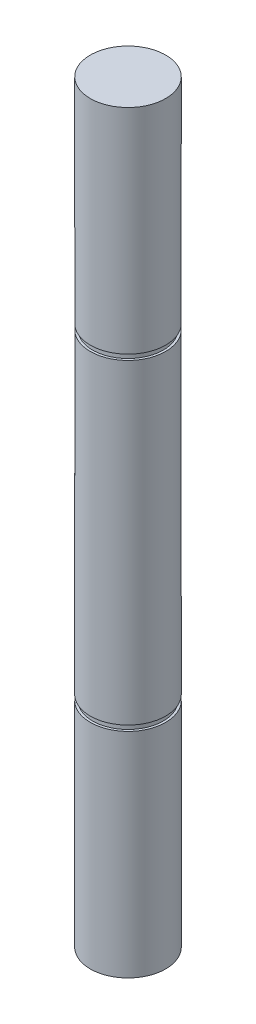
ISO-10303-21;
HEADER;
FILE_DESCRIPTION(('STEP AP214'),'2;1');
FILE_NAME('part.step','',(''),(''),'','','');
FILE_SCHEMA(('AUTOMOTIVE_DESIGN { 1 0 10303 214 1 1 1 1 }'));
ENDSEC;
DATA;
#1=APPLICATION_CONTEXT('core data for automotive mechanical design processes');
#2=APPLICATION_PROTOCOL_DEFINITION('international standard','automotive_design',2000,#1);
#3=PRODUCT_CONTEXT('',#1,'mechanical');
#4=PRODUCT('Part','Part','',(#3));
#5=PRODUCT_RELATED_PRODUCT_CATEGORY('part','',(#4));
#6=PRODUCT_DEFINITION_FORMATION('','',#4);
#7=PRODUCT_DEFINITION_CONTEXT('part definition',#1,'design');
#8=PRODUCT_DEFINITION('design','',#6,#7);
#9=PRODUCT_DEFINITION_SHAPE('','',#8);
#10=(LENGTH_UNIT() NAMED_UNIT(*) SI_UNIT(.MILLI.,.METRE.));
#11=(NAMED_UNIT(*) PLANE_ANGLE_UNIT() SI_UNIT($,.RADIAN.));
#12=(NAMED_UNIT(*) SI_UNIT($,.STERADIAN.) SOLID_ANGLE_UNIT());
#13=UNCERTAINTY_MEASURE_WITH_UNIT(LENGTH_MEASURE(1.E-05),#10,'distance_accuracy_value','');
#14=(GEOMETRIC_REPRESENTATION_CONTEXT(3) GLOBAL_UNCERTAINTY_ASSIGNED_CONTEXT((#13)) GLOBAL_UNIT_ASSIGNED_CONTEXT((#10,
#11,#12)) REPRESENTATION_CONTEXT('',''));
#15=CARTESIAN_POINT('',(0.,0.,0.));
#16=DIRECTION('',(0.,0.,1.));
#17=DIRECTION('',(1.,0.,0.));
#18=AXIS2_PLACEMENT_3D('',#15,#16,#17);
#19=CARTESIAN_POINT('',(0.,-95.25,0.));
#20=DIRECTION('',(0.,1.,0.));
#21=DIRECTION('',(0.,0.,1.));
#22=AXIS2_PLACEMENT_3D('',#19,#20,#21);
#23=CYLINDRICAL_SURFACE('',#22,4.7625);
#24=CARTESIAN_POINT('',(0.,-95.25,0.));
#25=DIRECTION('',(0.,1.,0.));
#26=DIRECTION('',(0.,0.,1.));
#27=AXIS2_PLACEMENT_3D('',#24,#25,#26);
#28=CIRCLE('',#27,4.7625);
#29=CARTESIAN_POINT('',(0.,-95.25,4.7625));
#30=VERTEX_POINT('',#29);
#31=EDGE_CURVE('E62',#30,#30,#28,.T.);
#32=ORIENTED_EDGE('',*,*,#31,.T.);
#33=EDGE_LOOP('',(#32));
#34=FACE_BOUND('',#33,.T.);
#35=CARTESIAN_POINT('',(0.,-68.2625,0.));
#36=DIRECTION('',(0.,1.,0.));
#37=DIRECTION('',(0.,0.,1.));
#38=AXIS2_PLACEMENT_3D('',#35,#36,#37);
#39=CIRCLE('',#38,4.7625);
#40=CARTESIAN_POINT('',(0.,-68.2625,4.7625));
#41=VERTEX_POINT('',#40);
#42=EDGE_CURVE('E68',#41,#41,#39,.F.);
#43=ORIENTED_EDGE('',*,*,#42,.T.);
#44=EDGE_LOOP('',(#43));
#45=FACE_BOUND('',#44,.T.);
#46=ADVANCED_FACE('F39',(#34,#45),#23,.T.);
#47=CARTESIAN_POINT('',(0.,-95.25,0.));
#48=DIRECTION('',(0.,1.,0.));
#49=DIRECTION('',(0.,0.,1.));
#50=AXIS2_PLACEMENT_3D('',#47,#48,#49);
#51=PLANE('',#50);
#52=ORIENTED_EDGE('',*,*,#31,.F.);
#53=EDGE_LOOP('',(#52));
#54=FACE_BOUND('',#53,.T.);
#55=ADVANCED_FACE('F86',(#54),#51,.F.);
#56=CARTESIAN_POINT('',(0.,-68.2625,0.));
#57=DIRECTION('',(0.,1.,0.));
#58=DIRECTION('',(0.,0.,1.));
#59=AXIS2_PLACEMENT_3D('',#56,#57,#58);
#60=PLANE('',#59);
#61=CARTESIAN_POINT('',(0.,-68.2625,0.));
#62=DIRECTION('',(0.,1.,0.));
#63=DIRECTION('',(0.,0.,1.));
#64=AXIS2_PLACEMENT_3D('',#61,#62,#63);
#65=CIRCLE('',#64,4.4704);
#66=CARTESIAN_POINT('',(0.,-68.2625,-4.4704));
#67=VERTEX_POINT('',#66);
#68=EDGE_CURVE('E72',#67,#67,#65,.T.);
#69=ORIENTED_EDGE('',*,*,#68,.F.);
#70=EDGE_LOOP('',(#69));
#71=FACE_BOUND('',#70,.T.);
#72=ORIENTED_EDGE('',*,*,#42,.F.);
#73=EDGE_LOOP('',(#72));
#74=FACE_BOUND('',#73,.T.);
#75=ADVANCED_FACE('F83',(#71,#74),#60,.T.);
#76=CARTESIAN_POINT('',(0.,-54.9324993815346,0.));
#77=DIRECTION('',(0.,-1.,0.));
#78=DIRECTION('',(0.,0.,-1.));
#79=AXIS2_PLACEMENT_3D('',#76,#77,#78);
#80=CYLINDRICAL_SURFACE('',#79,4.4704);
#81=CARTESIAN_POINT('',(0.,-67.5767,0.));
#82=DIRECTION('',(0.,1.,0.));
#83=DIRECTION('',(0.,0.,1.));
#84=AXIS2_PLACEMENT_3D('',#81,#82,#83);
#85=CIRCLE('',#84,4.4704);
#86=CARTESIAN_POINT('',(0.,-67.5767,-4.4704));
#87=VERTEX_POINT('',#86);
#88=EDGE_CURVE('E73',#87,#87,#85,.T.);
#89=CARTESIAN_POINT('',(0.,-68.2625,-4.4704));
#90=CARTESIAN_POINT('',(0.,-68.25535625,-4.4704));
#91=CARTESIAN_POINT('',(0.,-68.2482125,-4.4704));
#92=CARTESIAN_POINT('',(0.,-68.233925,-4.4704));
#93=CARTESIAN_POINT('',(0.,-68.22678125,-4.4704));
#94=CARTESIAN_POINT('',(0.,-68.21249375,-4.4704));
#95=CARTESIAN_POINT('',(0.,-68.20535,-4.4704));
#96=CARTESIAN_POINT('',(0.,-68.1910625,-4.4704));
#97=CARTESIAN_POINT('',(0.,-68.18391875,-4.4704));
#98=CARTESIAN_POINT('',(0.,-68.16963125,-4.4704));
#99=CARTESIAN_POINT('',(0.,-68.1624875,-4.4704));
#100=CARTESIAN_POINT('',(0.,-68.1482,-4.4704));
#101=CARTESIAN_POINT('',(0.,-68.14105625,-4.4704));
#102=CARTESIAN_POINT('',(0.,-68.12676875,-4.4704));
#103=CARTESIAN_POINT('',(0.,-68.119625,-4.4704));
#104=CARTESIAN_POINT('',(0.,-68.1053375,-4.4704));
#105=CARTESIAN_POINT('',(0.,-68.09819375,-4.4704));
#106=CARTESIAN_POINT('',(0.,-68.08390625,-4.4704));
#107=CARTESIAN_POINT('',(0.,-68.0767625,-4.4704));
#108=CARTESIAN_POINT('',(0.,-68.062475,-4.4704));
#109=CARTESIAN_POINT('',(0.,-68.05533125,-4.4704));
#110=CARTESIAN_POINT('',(0.,-68.04104375,-4.4704));
#111=CARTESIAN_POINT('',(0.,-68.0339,-4.4704));
#112=CARTESIAN_POINT('',(0.,-68.0196125,-4.4704));
#113=CARTESIAN_POINT('',(0.,-68.01246875,-4.4704));
#114=CARTESIAN_POINT('',(0.,-67.99818125,-4.4704));
#115=CARTESIAN_POINT('',(0.,-67.9910375,-4.4704));
#116=CARTESIAN_POINT('',(0.,-67.97675,-4.4704));
#117=CARTESIAN_POINT('',(0.,-67.96960625,-4.4704));
#118=CARTESIAN_POINT('',(0.,-67.95531875,-4.4704));
#119=CARTESIAN_POINT('',(0.,-67.948175,-4.4704));
#120=CARTESIAN_POINT('',(0.,-67.9338875,-4.4704));
#121=CARTESIAN_POINT('',(0.,-67.92674375,-4.4704));
#122=CARTESIAN_POINT('',(0.,-67.91245625,-4.4704));
#123=CARTESIAN_POINT('',(0.,-67.9053125,-4.4704));
#124=CARTESIAN_POINT('',(0.,-67.891025,-4.4704));
#125=CARTESIAN_POINT('',(0.,-67.88388125,-4.4704));
#126=CARTESIAN_POINT('',(0.,-67.86959375,-4.4704));
#127=CARTESIAN_POINT('',(0.,-67.86245,-4.4704));
#128=CARTESIAN_POINT('',(0.,-67.8481625,-4.4704));
#129=CARTESIAN_POINT('',(0.,-67.84101875,-4.4704));
#130=CARTESIAN_POINT('',(0.,-67.82673125,-4.4704));
#131=CARTESIAN_POINT('',(0.,-67.8195875,-4.4704));
#132=CARTESIAN_POINT('',(0.,-67.8053,-4.4704));
#133=CARTESIAN_POINT('',(0.,-67.79815625,-4.4704));
#134=CARTESIAN_POINT('',(0.,-67.78386875,-4.4704));
#135=CARTESIAN_POINT('',(0.,-67.776725,-4.4704));
#136=CARTESIAN_POINT('',(0.,-67.7624375,-4.4704));
#137=CARTESIAN_POINT('',(0.,-67.75529375,-4.4704));
#138=CARTESIAN_POINT('',(0.,-67.74100625,-4.4704));
#139=CARTESIAN_POINT('',(0.,-67.7338625,-4.4704));
#140=CARTESIAN_POINT('',(0.,-67.719575,-4.4704));
#141=CARTESIAN_POINT('',(0.,-67.71243125,-4.4704));
#142=CARTESIAN_POINT('',(0.,-67.69814375,-4.4704));
#143=CARTESIAN_POINT('',(0.,-67.691,-4.4704));
#144=CARTESIAN_POINT('',(0.,-67.6767125,-4.4704));
#145=CARTESIAN_POINT('',(0.,-67.66956875,-4.4704));
#146=CARTESIAN_POINT('',(0.,-67.65528125,-4.4704));
#147=CARTESIAN_POINT('',(0.,-67.6481375,-4.4704));
#148=CARTESIAN_POINT('',(0.,-67.63385,-4.4704));
#149=CARTESIAN_POINT('',(0.,-67.62670625,-4.4704));
#150=CARTESIAN_POINT('',(0.,-67.61241875,-4.4704));
#151=CARTESIAN_POINT('',(0.,-67.605275,-4.4704));
#152=CARTESIAN_POINT('',(0.,-67.5909875,-4.4704));
#153=CARTESIAN_POINT('',(0.,-67.58384375,-4.4704));
#154=CARTESIAN_POINT('',(0.,-67.5767,-4.4704));
#155=B_SPLINE_CURVE_WITH_KNOTS('',3,(#89,#90,#91,#92,#93,#94,#95,#96,#97,#98,#99,#100,#101,#102,
#103,#104,#105,#106,#107,#108,#109,#110,#111,#112,#113,#114,#115,#116,#117,#118,#119,#120,#121,
#122,#123,#124,#125,#126,#127,#128,#129,#130,#131,#132,#133,#134,#135,#136,#137,#138,#139,#140,
#141,#142,#143,#144,#145,#146,#147,#148,#149,#150,#151,#152,#153,#154),.UNSPECIFIED.,.F.,.F.,(4,
2,2,2,2,2,2,2,2,2,2,2,2,2,2,2,2,2,2,2,2,2,2,2,2,2,2,2,2,2,2,2,4),(0.,0.0214312499999952,
0.0428624999999905,0.0642937499999996,0.0857249999999948,0.10715624999999,0.128587499999999,
0.150018749999994,0.17144999999999,0.192881249999999,0.214312499999994,0.235743749999989,
0.257174999999998,0.278606249999994,0.300037499999989,0.321468749999998,0.342899999999993,
0.364331249999988,0.385762499999998,0.407193749999993,0.428624999999988,0.450056249999997,
0.471487499999992,0.492918749999988,0.514349999999997,0.535781249999992,0.557212499999987,
0.578643749999996,0.600074999999992,0.621506249999987,0.642937499999996,0.664368749999991,
0.685799999999986),.UNSPECIFIED.);
#156=EDGE_CURVE('BSEAM80',#67,#87,#155,.T.);
#157=ORIENTED_EDGE('',*,*,#68,.T.);
#158=ORIENTED_EDGE('',*,*,#88,.F.);
#159=ORIENTED_EDGE('',*,*,#156,.T.);
#160=ORIENTED_EDGE('',*,*,#156,.F.);
#161=EDGE_LOOP('',(#157,#159,#158,#160));
#162=FACE_BOUND('',#161,.T.);
#163=ADVANCED_FACE('F80',(#162),#80,.T.);
#164=CARTESIAN_POINT('',(0.,-95.25,0.));
#165=DIRECTION('',(0.,1.,0.));
#166=DIRECTION('',(0.,0.,1.));
#167=AXIS2_PLACEMENT_3D('',#164,#165,#166);
#168=CYLINDRICAL_SURFACE('',#167,4.7625);
#169=CARTESIAN_POINT('',(0.,-27.6733,0.));
#170=DIRECTION('',(0.,-1.,0.));
#171=DIRECTION('',(0.,0.,-1.));
#172=AXIS2_PLACEMENT_3D('',#169,#170,#171);
#173=CIRCLE('',#172,4.7625);
#174=CARTESIAN_POINT('',(0.,-27.6733,-4.7625));
#175=VERTEX_POINT('',#174);
#176=EDGE_CURVE('E48',#175,#175,#173,.F.);
#177=ORIENTED_EDGE('',*,*,#176,.F.);
#178=EDGE_LOOP('',(#177));
#179=FACE_BOUND('',#178,.T.);
#180=CARTESIAN_POINT('',(0.,-67.5767,0.));
#181=DIRECTION('',(0.,1.,0.));
#182=DIRECTION('',(0.,0.,1.));
#183=AXIS2_PLACEMENT_3D('',#180,#181,#182);
#184=CIRCLE('',#183,4.7625);
#185=CARTESIAN_POINT('',(0.,-67.5767,4.7625));
#186=VERTEX_POINT('',#185);
#187=EDGE_CURVE('E43',#186,#186,#184,.F.);
#188=ORIENTED_EDGE('',*,*,#187,.F.);
#189=EDGE_LOOP('',(#188));
#190=FACE_BOUND('',#189,.T.);
#191=ADVANCED_FACE('F41',(#179,#190),#168,.T.);
#192=CARTESIAN_POINT('',(0.,-67.5767,0.));
#193=DIRECTION('',(0.,1.,0.));
#194=DIRECTION('',(0.,0.,1.));
#195=AXIS2_PLACEMENT_3D('',#192,#193,#194);
#196=PLANE('',#195);
#197=ORIENTED_EDGE('',*,*,#88,.T.);
#198=EDGE_LOOP('',(#197));
#199=FACE_BOUND('',#198,.T.);
#200=ORIENTED_EDGE('',*,*,#187,.T.);
#201=EDGE_LOOP('',(#200));
#202=FACE_BOUND('',#201,.T.);
#203=ADVANCED_FACE('F104',(#199,#202),#196,.F.);
#204=CARTESIAN_POINT('',(0.,-27.6733,0.));
#205=DIRECTION('',(0.,-1.,0.));
#206=DIRECTION('',(0.,0.,-1.));
#207=AXIS2_PLACEMENT_3D('',#204,#205,#206);
#208=PLANE('',#207);
#209=CARTESIAN_POINT('',(0.,-27.6733,0.));
#210=DIRECTION('',(0.,1.,0.));
#211=DIRECTION('',(0.,0.,1.));
#212=AXIS2_PLACEMENT_3D('',#209,#210,#211);
#213=CIRCLE('',#212,4.4704);
#214=CARTESIAN_POINT('',(0.,-27.6733,-4.4704));
#215=VERTEX_POINT('',#214);
#216=EDGE_CURVE('E11',#215,#215,#213,.T.);
#217=ORIENTED_EDGE('',*,*,#216,.F.);
#218=EDGE_LOOP('',(#217));
#219=FACE_BOUND('',#218,.T.);
#220=ORIENTED_EDGE('',*,*,#176,.T.);
#221=EDGE_LOOP('',(#220));
#222=FACE_BOUND('',#221,.T.);
#223=ADVANCED_FACE('F106',(#219,#222),#208,.F.);
#224=CARTESIAN_POINT('',(0.,-14.3432993815346,0.));
#225=DIRECTION('',(0.,-1.,0.));
#226=DIRECTION('',(0.,0.,-1.));
#227=AXIS2_PLACEMENT_3D('',#224,#225,#226);
#228=CYLINDRICAL_SURFACE('',#227,4.4704);
#229=CARTESIAN_POINT('',(0.,-26.9875,0.));
#230=DIRECTION('',(0.,-1.,0.));
#231=DIRECTION('',(0.,0.,-1.));
#232=AXIS2_PLACEMENT_3D('',#229,#230,#231);
#233=CIRCLE('',#232,4.4704);
#234=CARTESIAN_POINT('',(0.,-26.9875,-4.4704));
#235=VERTEX_POINT('',#234);
#236=EDGE_CURVE('E59',#235,#235,#233,.T.);
#237=CARTESIAN_POINT('',(0.,-26.9875,-4.4704));
#238=CARTESIAN_POINT('',(0.,-26.99464375,-4.4704));
#239=CARTESIAN_POINT('',(0.,-27.0017875,-4.4704));
#240=CARTESIAN_POINT('',(0.,-27.016075,-4.4704));
#241=CARTESIAN_POINT('',(0.,-27.02321875,-4.4704));
#242=CARTESIAN_POINT('',(0.,-27.03750625,-4.4704));
#243=CARTESIAN_POINT('',(0.,-27.04465,-4.4704));
#244=CARTESIAN_POINT('',(0.,-27.0589375,-4.4704));
#245=CARTESIAN_POINT('',(0.,-27.06608125,-4.4704));
#246=CARTESIAN_POINT('',(0.,-27.08036875,-4.4704));
#247=CARTESIAN_POINT('',(0.,-27.0875125,-4.4704));
#248=CARTESIAN_POINT('',(0.,-27.1018,-4.4704));
#249=CARTESIAN_POINT('',(0.,-27.10894375,-4.4704));
#250=CARTESIAN_POINT('',(0.,-27.12323125,-4.4704));
#251=CARTESIAN_POINT('',(0.,-27.130375,-4.4704));
#252=CARTESIAN_POINT('',(0.,-27.1446625,-4.4704));
#253=CARTESIAN_POINT('',(0.,-27.15180625,-4.4704));
#254=CARTESIAN_POINT('',(0.,-27.16609375,-4.4704));
#255=CARTESIAN_POINT('',(0.,-27.1732375,-4.4704));
#256=CARTESIAN_POINT('',(0.,-27.187525,-4.4704));
#257=CARTESIAN_POINT('',(0.,-27.19466875,-4.4704));
#258=CARTESIAN_POINT('',(0.,-27.20895625,-4.4704));
#259=CARTESIAN_POINT('',(0.,-27.2161,-4.4704));
#260=CARTESIAN_POINT('',(0.,-27.2303875,-4.4704));
#261=CARTESIAN_POINT('',(0.,-27.23753125,-4.4704));
#262=CARTESIAN_POINT('',(0.,-27.25181875,-4.4704));
#263=CARTESIAN_POINT('',(0.,-27.2589625,-4.4704));
#264=CARTESIAN_POINT('',(0.,-27.27325,-4.4704));
#265=CARTESIAN_POINT('',(0.,-27.28039375,-4.4704));
#266=CARTESIAN_POINT('',(0.,-27.29468125,-4.4704));
#267=CARTESIAN_POINT('',(0.,-27.301825,-4.4704));
#268=CARTESIAN_POINT('',(0.,-27.3161125,-4.4704));
#269=CARTESIAN_POINT('',(0.,-27.32325625,-4.4704));
#270=CARTESIAN_POINT('',(0.,-27.33754375,-4.4704));
#271=CARTESIAN_POINT('',(0.,-27.3446875,-4.4704));
#272=CARTESIAN_POINT('',(0.,-27.358975,-4.4704));
#273=CARTESIAN_POINT('',(0.,-27.36611875,-4.4704));
#274=CARTESIAN_POINT('',(0.,-27.38040625,-4.4704));
#275=CARTESIAN_POINT('',(0.,-27.38755,-4.4704));
#276=CARTESIAN_POINT('',(0.,-27.4018375,-4.4704));
#277=CARTESIAN_POINT('',(0.,-27.40898125,-4.4704));
#278=CARTESIAN_POINT('',(0.,-27.42326875,-4.4704));
#279=CARTESIAN_POINT('',(0.,-27.4304125,-4.4704));
#280=CARTESIAN_POINT('',(0.,-27.4447,-4.4704));
#281=CARTESIAN_POINT('',(0.,-27.45184375,-4.4704));
#282=CARTESIAN_POINT('',(0.,-27.46613125,-4.4704));
#283=CARTESIAN_POINT('',(0.,-27.473275,-4.4704));
#284=CARTESIAN_POINT('',(0.,-27.4875625,-4.4704));
#285=CARTESIAN_POINT('',(0.,-27.49470625,-4.4704));
#286=CARTESIAN_POINT('',(0.,-27.50899375,-4.4704));
#287=CARTESIAN_POINT('',(0.,-27.5161375,-4.4704));
#288=CARTESIAN_POINT('',(0.,-27.530425,-4.4704));
#289=CARTESIAN_POINT('',(0.,-27.53756875,-4.4704));
#290=CARTESIAN_POINT('',(0.,-27.55185625,-4.4704));
#291=CARTESIAN_POINT('',(0.,-27.559,-4.4704));
#292=CARTESIAN_POINT('',(0.,-27.5732875,-4.4704));
#293=CARTESIAN_POINT('',(0.,-27.58043125,-4.4704));
#294=CARTESIAN_POINT('',(0.,-27.59471875,-4.4704));
#295=CARTESIAN_POINT('',(0.,-27.6018625,-4.4704));
#296=CARTESIAN_POINT('',(0.,-27.61615,-4.4704));
#297=CARTESIAN_POINT('',(0.,-27.62329375,-4.4704));
#298=CARTESIAN_POINT('',(0.,-27.63758125,-4.4704));
#299=CARTESIAN_POINT('',(0.,-27.644725,-4.4704));
#300=CARTESIAN_POINT('',(0.,-27.6590125,-4.4704));
#301=CARTESIAN_POINT('',(0.,-27.66615625,-4.4704));
#302=CARTESIAN_POINT('',(0.,-27.6733,-4.4704));
#303=B_SPLINE_CURVE_WITH_KNOTS('',3,(#237,#238,#239,#240,#241,#242,#243,#244,#245,#246,#247,
#248,#249,#250,#251,#252,#253,#254,#255,#256,#257,#258,#259,#260,#261,#262,#263,#264,#265,#266,
#267,#268,#269,#270,#271,#272,#273,#274,#275,#276,#277,#278,#279,#280,#281,#282,#283,#284,#285,
#286,#287,#288,#289,#290,#291,#292,#293,#294,#295,#296,#297,#298,#299,#300,#301,#302),
.UNSPECIFIED.,.F.,.F.,(4,2,2,2,2,2,2,2,2,2,2,2,2,2,2,2,2,2,2,2,2,2,2,2,2,2,2,2,2,2,2,2,4),(0.,
0.0214312499999987,0.0428625000000009,0.0642937500000031,0.0857250000000018,0.10715625,
0.128587500000003,0.150018750000001,0.17145,0.192881250000002,0.214312500000004,
0.235743750000003,0.257175000000002,0.278606250000004,0.300037500000003,0.321468750000001,
0.342900000000004,0.364331250000006,0.385762500000005,0.407193750000003,0.428625000000005,
0.450056250000004,0.471487500000003,0.492918750000005,0.514350000000007,0.535781250000006,
0.557212500000005,0.578643750000007,0.600075000000005,0.621506250000004,0.642937500000006,
0.664368750000009,0.685800000000007),.UNSPECIFIED.);
#304=EDGE_CURVE('BSEAM99',#235,#215,#303,.T.);
#305=ORIENTED_EDGE('',*,*,#236,.T.);
#306=ORIENTED_EDGE('',*,*,#216,.T.);
#307=ORIENTED_EDGE('',*,*,#304,.T.);
#308=ORIENTED_EDGE('',*,*,#304,.F.);
#309=EDGE_LOOP('',(#305,#307,#306,#308));
#310=FACE_BOUND('',#309,.T.);
#311=ADVANCED_FACE('F99',(#310),#228,.T.);
#312=CARTESIAN_POINT('',(0.,0.,0.));
#313=DIRECTION('',(0.,1.,0.));
#314=DIRECTION('',(0.,0.,1.));
#315=AXIS2_PLACEMENT_3D('',#312,#313,#314);
#316=PLANE('',#315);
#317=CARTESIAN_POINT('',(0.,0.,0.));
#318=DIRECTION('',(0.,1.,0.));
#319=DIRECTION('',(0.,0.,1.));
#320=AXIS2_PLACEMENT_3D('',#317,#318,#319);
#321=CIRCLE('',#320,4.7625);
#322=CARTESIAN_POINT('',(0.,0.,4.7625));
#323=VERTEX_POINT('',#322);
#324=EDGE_CURVE('E63',#323,#323,#321,.T.);
#325=ORIENTED_EDGE('',*,*,#324,.T.);
#326=EDGE_LOOP('',(#325));
#327=FACE_BOUND('',#326,.T.);
#328=ADVANCED_FACE('F113',(#327),#316,.T.);
#329=CARTESIAN_POINT('',(0.,-95.25,0.));
#330=DIRECTION('',(0.,1.,0.));
#331=DIRECTION('',(0.,0.,1.));
#332=AXIS2_PLACEMENT_3D('',#329,#330,#331);
#333=CYLINDRICAL_SURFACE('',#332,4.7625);
#334=ORIENTED_EDGE('',*,*,#324,.F.);
#335=EDGE_LOOP('',(#334));
#336=FACE_BOUND('',#335,.T.);
#337=CARTESIAN_POINT('',(0.,-26.9875,0.));
#338=DIRECTION('',(0.,-1.,0.));
#339=DIRECTION('',(0.,0.,-1.));
#340=AXIS2_PLACEMENT_3D('',#337,#338,#339);
#341=CIRCLE('',#340,4.7625);
#342=CARTESIAN_POINT('',(0.,-26.9875,-4.7625));
#343=VERTEX_POINT('',#342);
#344=EDGE_CURVE('E57',#343,#343,#341,.F.);
#345=ORIENTED_EDGE('',*,*,#344,.T.);
#346=EDGE_LOOP('',(#345));
#347=FACE_BOUND('',#346,.T.);
#348=ADVANCED_FACE('F152',(#336,#347),#333,.T.);
#349=CARTESIAN_POINT('',(0.,-26.9875,0.));
#350=DIRECTION('',(0.,-1.,0.));
#351=DIRECTION('',(0.,0.,-1.));
#352=AXIS2_PLACEMENT_3D('',#349,#350,#351);
#353=PLANE('',#352);
#354=ORIENTED_EDGE('',*,*,#236,.F.);
#355=EDGE_LOOP('',(#354));
#356=FACE_BOUND('',#355,.T.);
#357=ORIENTED_EDGE('',*,*,#344,.F.);
#358=EDGE_LOOP('',(#357));
#359=FACE_BOUND('',#358,.T.);
#360=ADVANCED_FACE('F162',(#356,#359),#353,.T.);
#361=CLOSED_SHELL('',(#46,#55,#75,#163,#191,#203,#223,#311,#328,#348,#360));
#362=MANIFOLD_SOLID_BREP('B2',#361);
#363=ADVANCED_BREP_SHAPE_REPRESENTATION('',(#18,#362),#14);
#364=SHAPE_DEFINITION_REPRESENTATION(#9,#363);
ENDSEC;
END-ISO-10303-21;
